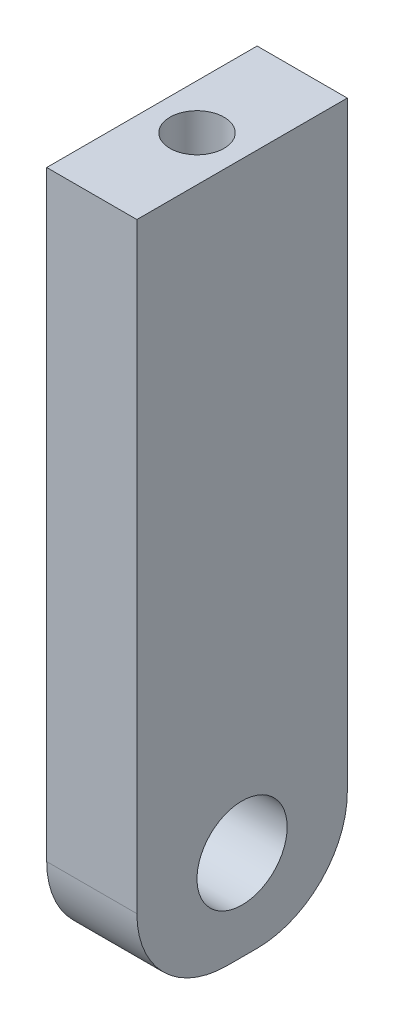
ISO-10303-21;
HEADER;
FILE_DESCRIPTION(('STEP AP214'),'2;1');
FILE_NAME('part.step','',(''),(''),'','','');
FILE_SCHEMA(('AUTOMOTIVE_DESIGN { 1 0 10303 214 1 1 1 1 }'));
ENDSEC;
DATA;
#1=APPLICATION_CONTEXT('core data for automotive mechanical design processes');
#2=APPLICATION_PROTOCOL_DEFINITION('international standard','automotive_design',2000,#1);
#3=PRODUCT_CONTEXT('',#1,'mechanical');
#4=PRODUCT('Part','Part','',(#3));
#5=PRODUCT_RELATED_PRODUCT_CATEGORY('part','',(#4));
#6=PRODUCT_DEFINITION_FORMATION('','',#4);
#7=PRODUCT_DEFINITION_CONTEXT('part definition',#1,'design');
#8=PRODUCT_DEFINITION('design','',#6,#7);
#9=PRODUCT_DEFINITION_SHAPE('','',#8);
#10=(LENGTH_UNIT() NAMED_UNIT(*) SI_UNIT(.MILLI.,.METRE.));
#11=(NAMED_UNIT(*) PLANE_ANGLE_UNIT() SI_UNIT($,.RADIAN.));
#12=(NAMED_UNIT(*) SI_UNIT($,.STERADIAN.) SOLID_ANGLE_UNIT());
#13=UNCERTAINTY_MEASURE_WITH_UNIT(LENGTH_MEASURE(1.E-05),#10,'distance_accuracy_value','');
#14=(GEOMETRIC_REPRESENTATION_CONTEXT(3) GLOBAL_UNCERTAINTY_ASSIGNED_CONTEXT((#13)) GLOBAL_UNIT_ASSIGNED_CONTEXT((#10,
#11,#12)) REPRESENTATION_CONTEXT('',''));
#15=CARTESIAN_POINT('',(0.,0.,0.));
#16=DIRECTION('',(0.,0.,1.));
#17=DIRECTION('',(1.,0.,0.));
#18=AXIS2_PLACEMENT_3D('',#15,#16,#17);
#19=CARTESIAN_POINT('',(3.,0.546254549383258,7.));
#20=DIRECTION('',(0.,-1.,0.));
#21=DIRECTION('',(1.,0.,0.));
#22=AXIS2_PLACEMENT_3D('',#19,#20,#21);
#23=PLANE('',#22);
#24=CARTESIAN_POINT('',(1.5,0.546254549383257,3.5));
#25=DIRECTION('',(0.,1.,0.));
#26=DIRECTION('',(-1.,0.,0.));
#27=AXIS2_PLACEMENT_3D('',#24,#25,#26);
#28=CIRCLE('',#27,0.9);
#29=CARTESIAN_POINT('',(0.6,0.546254549383257,3.5));
#30=VERTEX_POINT('',#29);
#31=EDGE_CURVE('E191',#30,#30,#28,.T.);
#32=ORIENTED_EDGE('',*,*,#31,.F.);
#33=EDGE_LOOP('',(#32));
#34=FACE_BOUND('',#33,.T.);
#35=DIRECTION('',(-1.,0.,0.));
#36=VECTOR('',#35,1.);
#37=CARTESIAN_POINT('',(3.,0.546254549383258,0.));
#38=LINE('',#37,#36);
#39=CARTESIAN_POINT('',(3.,0.546254549383258,0.));
#40=VERTEX_POINT('',#39);
#41=CARTESIAN_POINT('',(0.,0.546254549383257,0.));
#42=VERTEX_POINT('',#41);
#43=EDGE_CURVE('E113',#40,#42,#38,.T.);
#44=ORIENTED_EDGE('',*,*,#43,.T.);
#45=DIRECTION('',(0.,0.,-1.));
#46=VECTOR('',#45,1.);
#47=CARTESIAN_POINT('',(0.,0.546254549383257,7.));
#48=LINE('',#47,#46);
#49=CARTESIAN_POINT('',(0.,0.546254549383257,7.));
#50=VERTEX_POINT('',#49);
#51=EDGE_CURVE('E95',#50,#42,#48,.T.);
#52=ORIENTED_EDGE('',*,*,#51,.F.);
#53=DIRECTION('',(-1.,0.,0.));
#54=VECTOR('',#53,1.);
#55=CARTESIAN_POINT('',(3.,0.546254549383258,7.));
#56=LINE('',#55,#54);
#57=CARTESIAN_POINT('',(3.,0.546254549383258,7.));
#58=VERTEX_POINT('',#57);
#59=EDGE_CURVE('E102',#58,#50,#56,.T.);
#60=ORIENTED_EDGE('',*,*,#59,.F.);
#61=DIRECTION('',(0.,0.,-1.));
#62=VECTOR('',#61,1.);
#63=CARTESIAN_POINT('',(3.,0.546254549383258,7.));
#64=LINE('',#63,#62);
#65=EDGE_CURVE('E141',#58,#40,#64,.T.);
#66=ORIENTED_EDGE('',*,*,#65,.T.);
#67=EDGE_LOOP('',(#44,#52,#60,#66));
#68=FACE_BOUND('',#67,.T.);
#69=ADVANCED_FACE('F39',(#34,#68),#23,.F.);
#70=CARTESIAN_POINT('',(0.,0.546254549383257,7.));
#71=DIRECTION('',(1.,0.,0.));
#72=DIRECTION('',(0.,1.,0.));
#73=AXIS2_PLACEMENT_3D('',#70,#71,#72);
#74=PLANE('',#73);
#75=CARTESIAN_POINT('',(0.,-19.4537454506167,3.5));
#76=DIRECTION('',(1.,0.,0.));
#77=DIRECTION('',(0.,0.,-1.));
#78=AXIS2_PLACEMENT_3D('',#75,#76,#77);
#79=CIRCLE('',#78,1.5);
#80=CARTESIAN_POINT('',(0.,-19.4537454506167,2.));
#81=VERTEX_POINT('',#80);
#82=EDGE_CURVE('E147',#81,#81,#79,.T.);
#83=ORIENTED_EDGE('',*,*,#82,.T.);
#84=EDGE_LOOP('',(#83));
#85=FACE_BOUND('',#84,.T.);
#86=DIRECTION('',(0.,0.,-1.));
#87=VECTOR('',#86,1.);
#88=CARTESIAN_POINT('',(0.,-22.4537454506167,7.));
#89=LINE('',#88,#87);
#90=CARTESIAN_POINT('',(0.,-22.4537454506167,4.));
#91=VERTEX_POINT('',#90);
#92=CARTESIAN_POINT('',(0.,-22.4537454506167,3.));
#93=VERTEX_POINT('',#92);
#94=EDGE_CURVE('E115',#91,#93,#89,.T.);
#95=ORIENTED_EDGE('',*,*,#94,.F.);
#96=CARTESIAN_POINT('',(0.,-19.4537454506167,4.));
#97=DIRECTION('',(1.,0.,0.));
#98=DIRECTION('',(0.,1.,0.));
#99=AXIS2_PLACEMENT_3D('',#96,#97,#98);
#100=CIRCLE('',#99,3.);
#101=CARTESIAN_POINT('',(0.,-19.4537454506167,7.));
#102=VERTEX_POINT('',#101);
#103=EDGE_CURVE('E47',#91,#102,#100,.F.);
#104=ORIENTED_EDGE('',*,*,#103,.T.);
#105=DIRECTION('',(0.,-1.,0.));
#106=VECTOR('',#105,1.);
#107=CARTESIAN_POINT('',(0.,0.546254549383257,7.));
#108=LINE('',#107,#106);
#109=EDGE_CURVE('E91',#50,#102,#108,.T.);
#110=ORIENTED_EDGE('',*,*,#109,.F.);
#111=ORIENTED_EDGE('',*,*,#51,.T.);
#112=DIRECTION('',(0.,-1.,0.));
#113=VECTOR('',#112,1.);
#114=CARTESIAN_POINT('',(0.,0.546254549383257,0.));
#115=LINE('',#114,#113);
#116=CARTESIAN_POINT('',(0.,-19.4537454506167,0.));
#117=VERTEX_POINT('',#116);
#118=EDGE_CURVE('E146',#42,#117,#115,.T.);
#119=ORIENTED_EDGE('',*,*,#118,.T.);
#120=CARTESIAN_POINT('',(0.,-19.4537454506167,3.));
#121=DIRECTION('',(1.,0.,0.));
#122=DIRECTION('',(0.,1.,0.));
#123=AXIS2_PLACEMENT_3D('',#120,#121,#122);
#124=CIRCLE('',#123,3.);
#125=EDGE_CURVE('E59',#117,#93,#124,.F.);
#126=ORIENTED_EDGE('',*,*,#125,.T.);
#127=EDGE_LOOP('',(#95,#104,#110,#111,#119,#126));
#128=FACE_BOUND('',#127,.T.);
#129=ADVANCED_FACE('F93',(#85,#128),#74,.F.);
#130=CARTESIAN_POINT('',(0.,-22.4537454506167,7.));
#131=DIRECTION('',(0.,1.,0.));
#132=DIRECTION('',(0.,0.,1.));
#133=AXIS2_PLACEMENT_3D('',#130,#131,#132);
#134=PLANE('',#133);
#135=DIRECTION('',(0.,0.,-1.));
#136=VECTOR('',#135,1.);
#137=CARTESIAN_POINT('',(3.,-22.4537454506167,7.));
#138=LINE('',#137,#136);
#139=CARTESIAN_POINT('',(3.,-22.4537454506167,4.));
#140=VERTEX_POINT('',#139);
#141=CARTESIAN_POINT('',(3.,-22.4537454506167,3.));
#142=VERTEX_POINT('',#141);
#143=EDGE_CURVE('E119',#140,#142,#138,.T.);
#144=ORIENTED_EDGE('',*,*,#143,.F.);
#145=DIRECTION('',(1.,0.,0.));
#146=VECTOR('',#145,1.);
#147=CARTESIAN_POINT('',(0.,-22.4537454506167,4.));
#148=LINE('',#147,#146);
#149=EDGE_CURVE('E129',#140,#91,#148,.F.);
#150=ORIENTED_EDGE('',*,*,#149,.T.);
#151=ORIENTED_EDGE('',*,*,#94,.T.);
#152=DIRECTION('',(1.,0.,0.));
#153=VECTOR('',#152,1.);
#154=CARTESIAN_POINT('',(0.,-22.4537454506167,3.));
#155=LINE('',#154,#153);
#156=EDGE_CURVE('E126',#93,#142,#155,.T.);
#157=ORIENTED_EDGE('',*,*,#156,.T.);
#158=EDGE_LOOP('',(#144,#150,#151,#157));
#159=FACE_BOUND('',#158,.T.);
#160=ADVANCED_FACE('F134',(#159),#134,.F.);
#161=CARTESIAN_POINT('',(3.,-22.4537454506167,7.));
#162=DIRECTION('',(-1.,0.,0.));
#163=DIRECTION('',(0.,0.,1.));
#164=AXIS2_PLACEMENT_3D('',#161,#162,#163);
#165=PLANE('',#164);
#166=CARTESIAN_POINT('',(3.,-19.4537454506167,3.5));
#167=DIRECTION('',(1.,0.,0.));
#168=DIRECTION('',(0.,0.,-1.));
#169=AXIS2_PLACEMENT_3D('',#166,#167,#168);
#170=CIRCLE('',#169,1.5);
#171=CARTESIAN_POINT('',(3.,-19.4537454506167,2.));
#172=VERTEX_POINT('',#171);
#173=EDGE_CURVE('E190',#172,#172,#170,.T.);
#174=ORIENTED_EDGE('',*,*,#173,.F.);
#175=EDGE_LOOP('',(#174));
#176=FACE_BOUND('',#175,.T.);
#177=DIRECTION('',(0.,1.,0.));
#178=VECTOR('',#177,1.);
#179=CARTESIAN_POINT('',(3.,-22.4537454506167,7.));
#180=LINE('',#179,#178);
#181=CARTESIAN_POINT('',(3.,-19.4537454506167,7.));
#182=VERTEX_POINT('',#181);
#183=EDGE_CURVE('E101',#182,#58,#180,.T.);
#184=ORIENTED_EDGE('',*,*,#183,.F.);
#185=CARTESIAN_POINT('',(3.,-19.4537454506167,4.));
#186=DIRECTION('',(-1.,0.,0.));
#187=DIRECTION('',(0.,0.,1.));
#188=AXIS2_PLACEMENT_3D('',#185,#186,#187);
#189=CIRCLE('',#188,3.);
#190=EDGE_CURVE('E124',#182,#140,#189,.F.);
#191=ORIENTED_EDGE('',*,*,#190,.T.);
#192=ORIENTED_EDGE('',*,*,#143,.T.);
#193=CARTESIAN_POINT('',(3.,-19.4537454506167,3.));
#194=DIRECTION('',(-1.,0.,0.));
#195=DIRECTION('',(0.,0.,1.));
#196=AXIS2_PLACEMENT_3D('',#193,#194,#195);
#197=CIRCLE('',#196,3.);
#198=CARTESIAN_POINT('',(3.,-19.4537454506167,0.));
#199=VERTEX_POINT('',#198);
#200=EDGE_CURVE('E117',#142,#199,#197,.F.);
#201=ORIENTED_EDGE('',*,*,#200,.T.);
#202=DIRECTION('',(0.,1.,0.));
#203=VECTOR('',#202,1.);
#204=CARTESIAN_POINT('',(3.,-22.4537454506167,0.));
#205=LINE('',#204,#203);
#206=EDGE_CURVE('E110',#199,#40,#205,.T.);
#207=ORIENTED_EDGE('',*,*,#206,.T.);
#208=ORIENTED_EDGE('',*,*,#65,.F.);
#209=EDGE_LOOP('',(#184,#191,#192,#201,#207,#208));
#210=FACE_BOUND('',#209,.T.);
#211=ADVANCED_FACE('F140',(#176,#210),#165,.F.);
#212=CARTESIAN_POINT('',(0.,0.,7.));
#213=DIRECTION('',(0.,0.,1.));
#214=DIRECTION('',(1.,0.,0.));
#215=AXIS2_PLACEMENT_3D('',#212,#213,#214);
#216=PLANE('',#215);
#217=ORIENTED_EDGE('',*,*,#109,.T.);
#218=DIRECTION('',(1.,0.,0.));
#219=VECTOR('',#218,1.);
#220=CARTESIAN_POINT('',(3.,-19.4537454506167,7.));
#221=LINE('',#220,#219);
#222=EDGE_CURVE('E114',#102,#182,#221,.T.);
#223=ORIENTED_EDGE('',*,*,#222,.T.);
#224=ORIENTED_EDGE('',*,*,#183,.T.);
#225=ORIENTED_EDGE('',*,*,#59,.T.);
#226=EDGE_LOOP('',(#217,#223,#224,#225));
#227=FACE_BOUND('',#226,.T.);
#228=ADVANCED_FACE('F105',(#227),#216,.T.);
#229=CARTESIAN_POINT('',(0.,0.,0.));
#230=DIRECTION('',(0.,0.,1.));
#231=DIRECTION('',(1.,0.,0.));
#232=AXIS2_PLACEMENT_3D('',#229,#230,#231);
#233=PLANE('',#232);
#234=ORIENTED_EDGE('',*,*,#206,.F.);
#235=DIRECTION('',(1.,0.,0.));
#236=VECTOR('',#235,1.);
#237=CARTESIAN_POINT('',(0.,-19.4537454506167,0.));
#238=LINE('',#237,#236);
#239=EDGE_CURVE('E11',#199,#117,#238,.F.);
#240=ORIENTED_EDGE('',*,*,#239,.T.);
#241=ORIENTED_EDGE('',*,*,#118,.F.);
#242=ORIENTED_EDGE('',*,*,#43,.F.);
#243=EDGE_LOOP('',(#234,#240,#241,#242));
#244=FACE_BOUND('',#243,.T.);
#245=ADVANCED_FACE('F150',(#244),#233,.F.);
#246=CARTESIAN_POINT('',(0.,-19.4537454506167,3.5));
#247=DIRECTION('',(1.,0.,0.));
#248=DIRECTION('',(0.,0.,-1.));
#249=AXIS2_PLACEMENT_3D('',#246,#247,#248);
#250=CYLINDRICAL_SURFACE('',#249,1.5);
#251=CARTESIAN_POINT('',(0.,-19.4537454506167,2.));
#252=CARTESIAN_POINT('',(0.0312499999999995,-19.4537454506167,2.));
#253=CARTESIAN_POINT('',(0.0624999999999996,-19.4537454506167,2.));
#254=CARTESIAN_POINT('',(0.125,-19.4537454506167,2.));
#255=CARTESIAN_POINT('',(0.15625,-19.4537454506167,2.));
#256=CARTESIAN_POINT('',(0.21875,-19.4537454506167,2.));
#257=CARTESIAN_POINT('',(0.25,-19.4537454506167,2.));
#258=CARTESIAN_POINT('',(0.3125,-19.4537454506167,2.));
#259=CARTESIAN_POINT('',(0.34375,-19.4537454506167,2.));
#260=CARTESIAN_POINT('',(0.40625,-19.4537454506167,2.));
#261=CARTESIAN_POINT('',(0.4375,-19.4537454506167,2.));
#262=CARTESIAN_POINT('',(0.5,-19.4537454506167,2.));
#263=CARTESIAN_POINT('',(0.53125,-19.4537454506167,2.));
#264=CARTESIAN_POINT('',(0.59375,-19.4537454506167,2.));
#265=CARTESIAN_POINT('',(0.625,-19.4537454506167,2.));
#266=CARTESIAN_POINT('',(0.6875,-19.4537454506167,2.));
#267=CARTESIAN_POINT('',(0.71875,-19.4537454506167,2.));
#268=CARTESIAN_POINT('',(0.78125,-19.4537454506167,2.));
#269=CARTESIAN_POINT('',(0.8125,-19.4537454506167,2.));
#270=CARTESIAN_POINT('',(0.875,-19.4537454506167,2.));
#271=CARTESIAN_POINT('',(0.90625,-19.4537454506167,2.));
#272=CARTESIAN_POINT('',(0.96875,-19.4537454506167,2.));
#273=CARTESIAN_POINT('',(1.,-19.4537454506167,2.));
#274=CARTESIAN_POINT('',(1.0625,-19.4537454506167,2.));
#275=CARTESIAN_POINT('',(1.09375,-19.4537454506167,2.));
#276=CARTESIAN_POINT('',(1.15625,-19.4537454506167,2.));
#277=CARTESIAN_POINT('',(1.1875,-19.4537454506167,2.));
#278=CARTESIAN_POINT('',(1.25,-19.4537454506167,2.));
#279=CARTESIAN_POINT('',(1.28125,-19.4537454506167,2.));
#280=CARTESIAN_POINT('',(1.34375,-19.4537454506167,2.));
#281=CARTESIAN_POINT('',(1.375,-19.4537454506167,2.));
#282=CARTESIAN_POINT('',(1.4375,-19.4537454506167,2.));
#283=CARTESIAN_POINT('',(1.46875,-19.4537454506167,2.));
#284=CARTESIAN_POINT('',(1.53125,-19.4537454506167,2.));
#285=CARTESIAN_POINT('',(1.5625,-19.4537454506167,2.));
#286=CARTESIAN_POINT('',(1.625,-19.4537454506167,2.));
#287=CARTESIAN_POINT('',(1.65625,-19.4537454506167,2.));
#288=CARTESIAN_POINT('',(1.71875,-19.4537454506167,2.));
#289=CARTESIAN_POINT('',(1.75,-19.4537454506167,2.));
#290=CARTESIAN_POINT('',(1.8125,-19.4537454506167,2.));
#291=CARTESIAN_POINT('',(1.84375,-19.4537454506167,2.));
#292=CARTESIAN_POINT('',(1.90625,-19.4537454506167,2.));
#293=CARTESIAN_POINT('',(1.9375,-19.4537454506167,2.));
#294=CARTESIAN_POINT('',(2.,-19.4537454506167,2.));
#295=CARTESIAN_POINT('',(2.03125,-19.4537454506167,2.));
#296=CARTESIAN_POINT('',(2.09375,-19.4537454506167,2.));
#297=CARTESIAN_POINT('',(2.125,-19.4537454506167,2.));
#298=CARTESIAN_POINT('',(2.1875,-19.4537454506167,2.));
#299=CARTESIAN_POINT('',(2.21875,-19.4537454506167,2.));
#300=CARTESIAN_POINT('',(2.28125,-19.4537454506167,2.));
#301=CARTESIAN_POINT('',(2.3125,-19.4537454506167,2.));
#302=CARTESIAN_POINT('',(2.375,-19.4537454506167,2.));
#303=CARTESIAN_POINT('',(2.40625,-19.4537454506167,2.));
#304=CARTESIAN_POINT('',(2.46875,-19.4537454506167,2.));
#305=CARTESIAN_POINT('',(2.5,-19.4537454506167,2.));
#306=CARTESIAN_POINT('',(2.5625,-19.4537454506167,2.));
#307=CARTESIAN_POINT('',(2.59375,-19.4537454506167,2.));
#308=CARTESIAN_POINT('',(2.65625,-19.4537454506167,2.));
#309=CARTESIAN_POINT('',(2.6875,-19.4537454506167,2.));
#310=CARTESIAN_POINT('',(2.75,-19.4537454506167,2.));
#311=CARTESIAN_POINT('',(2.78125,-19.4537454506167,2.));
#312=CARTESIAN_POINT('',(2.84375,-19.4537454506167,2.));
#313=CARTESIAN_POINT('',(2.875,-19.4537454506167,2.));
#314=CARTESIAN_POINT('',(2.9375,-19.4537454506167,2.));
#315=CARTESIAN_POINT('',(2.96875,-19.4537454506167,2.));
#316=CARTESIAN_POINT('',(3.,-19.4537454506167,2.));
#317=B_SPLINE_CURVE_WITH_KNOTS('',3,(#251,#252,#253,#254,#255,#256,#257,#258,#259,#260,#261,
#262,#263,#264,#265,#266,#267,#268,#269,#270,#271,#272,#273,#274,#275,#276,#277,#278,#279,#280,
#281,#282,#283,#284,#285,#286,#287,#288,#289,#290,#291,#292,#293,#294,#295,#296,#297,#298,#299,
#300,#301,#302,#303,#304,#305,#306,#307,#308,#309,#310,#311,#312,#313,#314,#315,#316),
.UNSPECIFIED.,.F.,.F.,(4,2,2,2,2,2,2,2,2,2,2,2,2,2,2,2,2,2,2,2,2,2,2,2,2,2,2,2,2,2,2,2,4),(0.,
0.09375,0.1875,0.28125,0.375,0.46875,0.5625,0.65625,0.75,0.84375,0.9375,1.03125,1.125,1.21875,
1.3125,1.40625,1.5,1.59375,1.6875,1.78125,1.875,1.96875,2.0625,2.15625,2.25,2.34375,2.4375,
2.53125,2.625,2.71875,2.8125,2.90625,3.),.UNSPECIFIED.);
#318=EDGE_CURVE('BSEAM161',#81,#172,#317,.T.);
#319=ORIENTED_EDGE('',*,*,#82,.F.);
#320=ORIENTED_EDGE('',*,*,#173,.T.);
#321=ORIENTED_EDGE('',*,*,#318,.T.);
#322=ORIENTED_EDGE('',*,*,#318,.F.);
#323=EDGE_LOOP('',(#319,#321,#320,#322));
#324=FACE_BOUND('',#323,.T.);
#325=ADVANCED_FACE('F161',(#324),#250,.F.);
#326=CARTESIAN_POINT('',(0.,-19.4537454506167,4.));
#327=DIRECTION('',(-1.,0.,0.));
#328=DIRECTION('',(0.,0.,1.));
#329=AXIS2_PLACEMENT_3D('',#326,#327,#328);
#330=CYLINDRICAL_SURFACE('',#329,3.);
#331=ORIENTED_EDGE('',*,*,#103,.F.);
#332=ORIENTED_EDGE('',*,*,#149,.F.);
#333=ORIENTED_EDGE('',*,*,#190,.F.);
#334=ORIENTED_EDGE('',*,*,#222,.F.);
#335=EDGE_LOOP('',(#331,#332,#333,#334));
#336=FACE_BOUND('',#335,.T.);
#337=ADVANCED_FACE('F138',(#336),#330,.T.);
#338=CARTESIAN_POINT('',(0.,-19.4537454506167,3.));
#339=DIRECTION('',(1.,0.,0.));
#340=DIRECTION('',(0.,0.,-1.));
#341=AXIS2_PLACEMENT_3D('',#338,#339,#340);
#342=CYLINDRICAL_SURFACE('',#341,3.);
#343=ORIENTED_EDGE('',*,*,#125,.F.);
#344=ORIENTED_EDGE('',*,*,#239,.F.);
#345=ORIENTED_EDGE('',*,*,#200,.F.);
#346=ORIENTED_EDGE('',*,*,#156,.F.);
#347=EDGE_LOOP('',(#343,#344,#345,#346));
#348=FACE_BOUND('',#347,.T.);
#349=ADVANCED_FACE('F41',(#348),#342,.T.);
#350=CARTESIAN_POINT('',(1.5,-6.45374545061674,3.5));
#351=DIRECTION('',(0.,1.,0.));
#352=DIRECTION('',(-1.,0.,0.));
#353=AXIS2_PLACEMENT_3D('',#350,#351,#352);
#354=CYLINDRICAL_SURFACE('',#353,0.9);
#355=CARTESIAN_POINT('',(1.5,-6.45374545061674,3.5));
#356=DIRECTION('',(0.,1.,0.));
#357=DIRECTION('',(-1.,0.,0.));
#358=AXIS2_PLACEMENT_3D('',#355,#356,#357);
#359=CIRCLE('',#358,0.9);
#360=CARTESIAN_POINT('',(0.600000000000001,-6.45374545061674,3.5));
#361=VERTEX_POINT('',#360);
#362=EDGE_CURVE('E189',#361,#361,#359,.T.);
#363=ORIENTED_EDGE('',*,*,#362,.F.);
#364=EDGE_LOOP('',(#363));
#365=FACE_BOUND('',#364,.T.);
#366=ORIENTED_EDGE('',*,*,#31,.T.);
#367=EDGE_LOOP('',(#366));
#368=FACE_BOUND('',#367,.T.);
#369=ADVANCED_FACE('F152',(#365,#368),#354,.F.);
#370=CARTESIAN_POINT('',(1.5,-6.45374545061674,3.5));
#371=DIRECTION('',(0.,1.,0.));
#372=DIRECTION('',(-1.,0.,0.));
#373=AXIS2_PLACEMENT_3D('',#370,#371,#372);
#374=PLANE('',#373);
#375=ORIENTED_EDGE('',*,*,#362,.T.);
#376=EDGE_LOOP('',(#375));
#377=FACE_BOUND('',#376,.T.);
#378=ADVANCED_FACE('F158',(#377),#374,.T.);
#379=CLOSED_SHELL('',(#69,#129,#160,#211,#228,#245,#325,#337,#349,#369,#378));
#380=MANIFOLD_SOLID_BREP('B2',#379);
#381=ADVANCED_BREP_SHAPE_REPRESENTATION('',(#18,#380),#14);
#382=SHAPE_DEFINITION_REPRESENTATION(#9,#381);
ENDSEC;
END-ISO-10303-21;
